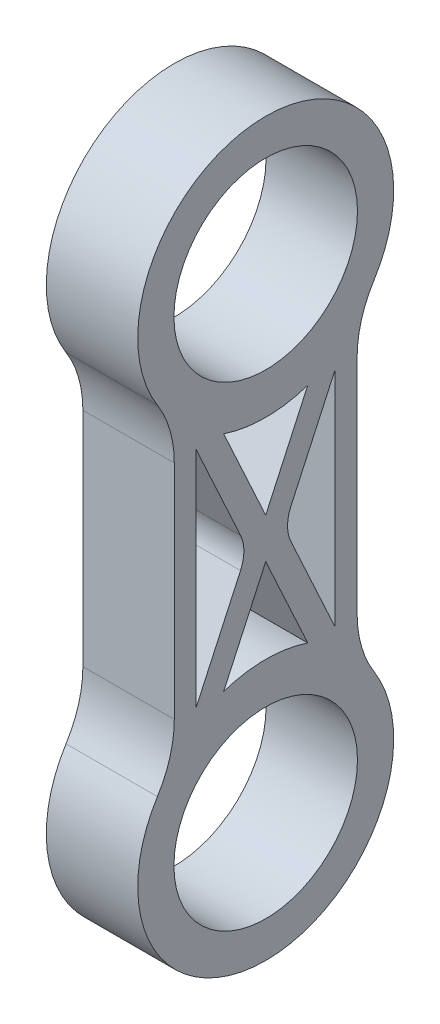
ISO-10303-21;
HEADER;
FILE_DESCRIPTION(('STEP AP214'),'2;1');
FILE_NAME('part.step','',(''),(''),'','','');
FILE_SCHEMA(('AUTOMOTIVE_DESIGN { 1 0 10303 214 1 1 1 1 }'));
ENDSEC;
DATA;
#1=APPLICATION_CONTEXT('core data for automotive mechanical design processes');
#2=APPLICATION_PROTOCOL_DEFINITION('international standard','automotive_design',2000,#1);
#3=PRODUCT_CONTEXT('',#1,'mechanical');
#4=PRODUCT('Part','Part','',(#3));
#5=PRODUCT_RELATED_PRODUCT_CATEGORY('part','',(#4));
#6=PRODUCT_DEFINITION_FORMATION('','',#4);
#7=PRODUCT_DEFINITION_CONTEXT('part definition',#1,'design');
#8=PRODUCT_DEFINITION('design','',#6,#7);
#9=PRODUCT_DEFINITION_SHAPE('','',#8);
#10=(LENGTH_UNIT() NAMED_UNIT(*) SI_UNIT(.MILLI.,.METRE.));
#11=(NAMED_UNIT(*) PLANE_ANGLE_UNIT() SI_UNIT($,.RADIAN.));
#12=(NAMED_UNIT(*) SI_UNIT($,.STERADIAN.) SOLID_ANGLE_UNIT());
#13=UNCERTAINTY_MEASURE_WITH_UNIT(LENGTH_MEASURE(1.E-05),#10,'distance_accuracy_value','');
#14=(GEOMETRIC_REPRESENTATION_CONTEXT(3) GLOBAL_UNCERTAINTY_ASSIGNED_CONTEXT((#13)) GLOBAL_UNIT_ASSIGNED_CONTEXT((#10,
#11,#12)) REPRESENTATION_CONTEXT('',''));
#15=CARTESIAN_POINT('',(0.,0.,0.));
#16=DIRECTION('',(0.,0.,1.));
#17=DIRECTION('',(1.,0.,0.));
#18=AXIS2_PLACEMENT_3D('',#15,#16,#17);
#19=CARTESIAN_POINT('',(2.5,38.670285511681,35.9952211988792));
#20=DIRECTION('',(0.,0.,-1.));
#21=DIRECTION('',(-1.,0.,0.));
#22=AXIS2_PLACEMENT_3D('',#19,#20,#21);
#23=PLANE('',#22);
#24=DIRECTION('',(0.,-1.,0.));
#25=VECTOR('',#24,1.);
#26=CARTESIAN_POINT('',(2.5,38.670285511681,35.9952211988792));
#27=LINE('',#26,#25);
#28=CARTESIAN_POINT('',(2.5,35.2061838965432,35.9952211988792));
#29=VERTEX_POINT('',#28);
#30=CARTESIAN_POINT('',(2.5,29.1343871268187,35.9952211988792));
#31=VERTEX_POINT('',#30);
#32=EDGE_CURVE('E309',#29,#31,#27,.T.);
#33=ORIENTED_EDGE('',*,*,#32,.F.);
#34=DIRECTION('',(1.,0.,0.));
#35=VECTOR('',#34,1.);
#36=CARTESIAN_POINT('',(2.5,35.2061838965432,35.9952211988792));
#37=LINE('',#36,#35);
#38=CARTESIAN_POINT('',(0.,35.2061838965432,35.9952211988792));
#39=VERTEX_POINT('',#38);
#40=EDGE_CURVE('E323',#29,#39,#37,.F.);
#41=ORIENTED_EDGE('',*,*,#40,.T.);
#42=DIRECTION('',(0.,-1.,0.));
#43=VECTOR('',#42,1.);
#44=CARTESIAN_POINT('',(0.,38.670285511681,35.9952211988792));
#45=LINE('',#44,#43);
#46=CARTESIAN_POINT('',(0.,29.1343871268187,35.9952211988792));
#47=VERTEX_POINT('',#46);
#48=EDGE_CURVE('E306',#39,#47,#45,.T.);
#49=ORIENTED_EDGE('',*,*,#48,.T.);
#50=DIRECTION('',(1.,0.,0.));
#51=VECTOR('',#50,1.);
#52=CARTESIAN_POINT('',(2.5,29.1343871268187,35.9952211988792));
#53=LINE('',#52,#51);
#54=EDGE_CURVE('E316',#47,#31,#53,.T.);
#55=ORIENTED_EDGE('',*,*,#54,.T.);
#56=EDGE_LOOP('',(#33,#41,#49,#55));
#57=FACE_BOUND('',#56,.T.);
#58=ADVANCED_FACE('F37',(#57),#23,.F.);
#59=CARTESIAN_POINT('',(2.5,38.670285511681,30.9952211988792));
#60=DIRECTION('',(0.,0.,1.));
#61=DIRECTION('',(0.,-1.,0.));
#62=AXIS2_PLACEMENT_3D('',#59,#60,#61);
#63=PLANE('',#62);
#64=DIRECTION('',(0.,1.,0.));
#65=VECTOR('',#64,1.);
#66=CARTESIAN_POINT('',(0.,38.670285511681,30.9952211988792));
#67=LINE('',#66,#65);
#68=CARTESIAN_POINT('',(0.,29.1343871268187,30.9952211988791));
#69=VERTEX_POINT('',#68);
#70=CARTESIAN_POINT('',(0.,35.2061838965432,30.9952211988792));
#71=VERTEX_POINT('',#70);
#72=EDGE_CURVE('E313',#69,#71,#67,.T.);
#73=ORIENTED_EDGE('',*,*,#72,.T.);
#74=DIRECTION('',(1.,0.,0.));
#75=VECTOR('',#74,1.);
#76=CARTESIAN_POINT('',(2.5,35.2061838965432,30.9952211988792));
#77=LINE('',#76,#75);
#78=CARTESIAN_POINT('',(2.5,35.2061838965432,30.9952211988792));
#79=VERTEX_POINT('',#78);
#80=EDGE_CURVE('E333',#71,#79,#77,.T.);
#81=ORIENTED_EDGE('',*,*,#80,.T.);
#82=DIRECTION('',(0.,1.,0.));
#83=VECTOR('',#82,1.);
#84=CARTESIAN_POINT('',(2.5,38.670285511681,30.9952211988792));
#85=LINE('',#84,#83);
#86=CARTESIAN_POINT('',(2.5,29.1343871268187,30.9952211988791));
#87=VERTEX_POINT('',#86);
#88=EDGE_CURVE('E312',#87,#79,#85,.T.);
#89=ORIENTED_EDGE('',*,*,#88,.F.);
#90=DIRECTION('',(1.,0.,0.));
#91=VECTOR('',#90,1.);
#92=CARTESIAN_POINT('',(2.5,29.1343871268187,30.9952211988791));
#93=LINE('',#92,#91);
#94=EDGE_CURVE('E330',#87,#69,#93,.F.);
#95=ORIENTED_EDGE('',*,*,#94,.T.);
#96=EDGE_LOOP('',(#73,#81,#89,#95));
#97=FACE_BOUND('',#96,.T.);
#98=ADVANCED_FACE('F401',(#97),#63,.F.);
#99=CARTESIAN_POINT('',(2.5,38.670285511681,33.4952211988792));
#100=DIRECTION('',(-1.,0.,0.));
#101=DIRECTION('',(0.,0.,1.));
#102=AXIS2_PLACEMENT_3D('',#99,#100,#101);
#103=PLANE('',#102);
#104=DIRECTION('',(0.,-0.908490452678574,-0.417905608232146));
#105=VECTOR('',#104,1.);
#106=CARTESIAN_POINT('',(2.5,35.2207957688978,34.6452211988792));
#107=LINE('',#106,#105);
#108=CARTESIAN_POINT('',(2.5,35.2207957688978,34.6452211988792));
#109=VERTEX_POINT('',#108);
#110=CARTESIAN_POINT('',(2.5,32.7207957688978,33.4952211988792));
#111=VERTEX_POINT('',#110);
#112=EDGE_CURVE('E233',#109,#111,#107,.T.);
#113=ORIENTED_EDGE('',*,*,#112,.F.);
#114=CARTESIAN_POINT('',(2.5,38.670285511681,33.4952211988792));
#115=DIRECTION('',(-1.,0.,0.));
#116=DIRECTION('',(0.,0.,-1.));
#117=AXIS2_PLACEMENT_3D('',#114,#115,#116);
#118=CIRCLE('',#117,3.63613524027454);
#119=CARTESIAN_POINT('',(2.5,35.2207957688978,32.3452211988791));
#120=VERTEX_POINT('',#119);
#121=EDGE_CURVE('E219',#120,#109,#118,.T.);
#122=ORIENTED_EDGE('',*,*,#121,.F.);
#123=DIRECTION('',(0.,0.908490452678574,-0.417905608232146));
#124=VECTOR('',#123,1.);
#125=CARTESIAN_POINT('',(2.5,32.7207957688978,33.4952211988792));
#126=LINE('',#125,#124);
#127=EDGE_CURVE('E225',#111,#120,#126,.T.);
#128=ORIENTED_EDGE('',*,*,#127,.F.);
#129=EDGE_LOOP('',(#113,#122,#128));
#130=FACE_BOUND('',#129,.T.);
#131=DIRECTION('',(0.,-0.908490452678575,-0.417905608232144));
#132=VECTOR('',#131,1.);
#133=CARTESIAN_POINT('',(2.5,29.1197752544641,31.5952211988791));
#134=LINE('',#133,#132);
#135=CARTESIAN_POINT('',(2.5,31.7523799034488,32.8062193374121));
#136=VERTEX_POINT('',#135);
#137=CARTESIAN_POINT('',(2.5,29.1197752544641,31.5952211988791));
#138=VERTEX_POINT('',#137);
#139=EDGE_CURVE('E255',#136,#138,#134,.T.);
#140=ORIENTED_EDGE('',*,*,#139,.F.);
#141=CARTESIAN_POINT('',(2.5,32.170285511681,31.8977288847335));
#142=DIRECTION('',(-1.,0.,0.));
#143=DIRECTION('',(0.,0.,1.));
#144=AXIS2_PLACEMENT_3D('',#141,#142,#143);
#145=CIRCLE('',#144,1.);
#146=CARTESIAN_POINT('',(2.5,32.5881911199131,32.8062193374121));
#147=VERTEX_POINT('',#146);
#148=EDGE_CURVE('E45',#136,#147,#145,.T.);
#149=ORIENTED_EDGE('',*,*,#148,.T.);
#150=DIRECTION('',(0.,-0.908490452678574,0.417905608232145));
#151=VECTOR('',#150,1.);
#152=CARTESIAN_POINT('',(2.5,32.170285511681,32.9984559171989));
#153=LINE('',#152,#151);
#154=CARTESIAN_POINT('',(2.5,35.2207957688978,31.5952211988791));
#155=VERTEX_POINT('',#154);
#156=EDGE_CURVE('E240',#155,#147,#153,.T.);
#157=ORIENTED_EDGE('',*,*,#156,.F.);
#158=DIRECTION('',(0.,1.,0.));
#159=VECTOR('',#158,1.);
#160=CARTESIAN_POINT('',(2.5,35.2207957688978,31.5952211988791));
#161=LINE('',#160,#159);
#162=EDGE_CURVE('E248',#138,#155,#161,.T.);
#163=ORIENTED_EDGE('',*,*,#162,.F.);
#164=EDGE_LOOP('',(#140,#149,#157,#163));
#165=FACE_BOUND('',#164,.T.);
#166=CARTESIAN_POINT('',(2.5,25.670285511681,33.4952211988792));
#167=DIRECTION('',(-1.,0.,0.));
#168=DIRECTION('',(0.,0.,1.));
#169=AXIS2_PLACEMENT_3D('',#166,#167,#168);
#170=CIRCLE('',#169,3.63613524027453);
#171=CARTESIAN_POINT('',(2.5,29.1197752544641,34.6452211988792));
#172=VERTEX_POINT('',#171);
#173=CARTESIAN_POINT('',(2.5,29.1197752544641,32.3452211988791));
#174=VERTEX_POINT('',#173);
#175=EDGE_CURVE('E211',#172,#174,#170,.T.);
#176=ORIENTED_EDGE('',*,*,#175,.F.);
#177=DIRECTION('',(0.,-0.908490452678574,0.417905608232146));
#178=VECTOR('',#177,1.);
#179=CARTESIAN_POINT('',(2.5,31.6197752544641,33.4952211988792));
#180=LINE('',#179,#178);
#181=CARTESIAN_POINT('',(2.5,31.6197752544641,33.4952211988792));
#182=VERTEX_POINT('',#181);
#183=EDGE_CURVE('E193',#182,#172,#180,.T.);
#184=ORIENTED_EDGE('',*,*,#183,.F.);
#185=DIRECTION('',(0.,0.908490452678574,0.417905608232146));
#186=VECTOR('',#185,1.);
#187=CARTESIAN_POINT('',(2.5,31.6197752544641,33.4952211988792));
#188=LINE('',#187,#186);
#189=EDGE_CURVE('E208',#174,#182,#188,.T.);
#190=ORIENTED_EDGE('',*,*,#189,.F.);
#191=EDGE_LOOP('',(#176,#184,#190));
#192=FACE_BOUND('',#191,.T.);
#193=DIRECTION('',(0.,-1.,0.));
#194=VECTOR('',#193,1.);
#195=CARTESIAN_POINT('',(2.5,35.2207957688978,35.3952211988791));
#196=LINE('',#195,#194);
#197=CARTESIAN_POINT('',(2.5,35.2207957688978,35.3952211988791));
#198=VERTEX_POINT('',#197);
#199=CARTESIAN_POINT('',(2.5,29.1197752544641,35.3952211988791));
#200=VERTEX_POINT('',#199);
#201=EDGE_CURVE('E275',#198,#200,#196,.T.);
#202=ORIENTED_EDGE('',*,*,#201,.F.);
#203=DIRECTION('',(0.,0.908490452678575,0.417905608232145));
#204=VECTOR('',#203,1.);
#205=CARTESIAN_POINT('',(2.5,32.170285511681,33.9919864805594));
#206=LINE('',#205,#204);
#207=CARTESIAN_POINT('',(2.5,32.5881911199131,34.1842230603462));
#208=VERTEX_POINT('',#207);
#209=EDGE_CURVE('E261',#208,#198,#206,.T.);
#210=ORIENTED_EDGE('',*,*,#209,.F.);
#211=CARTESIAN_POINT('',(2.5,32.170285511681,35.0927135130248));
#212=DIRECTION('',(-1.,0.,0.));
#213=DIRECTION('',(0.,0.,1.));
#214=AXIS2_PLACEMENT_3D('',#211,#212,#213);
#215=CIRCLE('',#214,1.);
#216=CARTESIAN_POINT('',(2.5,31.7523799034488,34.1842230603462));
#217=VERTEX_POINT('',#216);
#218=EDGE_CURVE('E365',#208,#217,#215,.T.);
#219=ORIENTED_EDGE('',*,*,#218,.T.);
#220=DIRECTION('',(0.,0.908490452678574,-0.417905608232145));
#221=VECTOR('',#220,1.);
#222=CARTESIAN_POINT('',(2.5,29.1197752544641,35.3952211988791));
#223=LINE('',#222,#221);
#224=EDGE_CURVE('E267',#200,#217,#223,.T.);
#225=ORIENTED_EDGE('',*,*,#224,.F.);
#226=EDGE_LOOP('',(#202,#210,#219,#225));
#227=FACE_BOUND('',#226,.T.);
#228=CARTESIAN_POINT('',(2.5,38.670285511681,33.4952211988792));
#229=DIRECTION('',(1.,0.,0.));
#230=DIRECTION('',(0.,0.,-1.));
#231=AXIS2_PLACEMENT_3D('',#228,#229,#230);
#232=CIRCLE('',#231,2.51);
#233=CARTESIAN_POINT('',(2.5,38.670285511681,30.9852211988791));
#234=VERTEX_POINT('',#233);
#235=EDGE_CURVE('E289',#234,#234,#232,.T.);
#236=ORIENTED_EDGE('',*,*,#235,.F.);
#237=EDGE_LOOP('',(#236));
#238=FACE_BOUND('',#237,.T.);
#239=CARTESIAN_POINT('',(2.5,25.670285511681,33.4952211988792));
#240=DIRECTION('',(1.,0.,0.));
#241=DIRECTION('',(0.,0.,-1.));
#242=AXIS2_PLACEMENT_3D('',#239,#240,#241);
#243=CIRCLE('',#242,2.51);
#244=CARTESIAN_POINT('',(2.5,25.670285511681,30.9852211988791));
#245=VERTEX_POINT('',#244);
#246=EDGE_CURVE('E282',#245,#245,#243,.T.);
#247=ORIENTED_EDGE('',*,*,#246,.F.);
#248=EDGE_LOOP('',(#247));
#249=FACE_BOUND('',#248,.T.);
#250=CARTESIAN_POINT('',(2.5,38.670285511681,33.4952211988792));
#251=DIRECTION('',(1.,0.,0.));
#252=DIRECTION('',(0.,0.,-1.));
#253=AXIS2_PLACEMENT_3D('',#250,#251,#252);
#254=CIRCLE('',#253,3.5);
#255=CARTESIAN_POINT('',(2.5,36.8050000266068,30.5336827373407));
#256=VERTEX_POINT('',#255);
#257=CARTESIAN_POINT('',(2.5,36.8050000266068,36.4567596604176));
#258=VERTEX_POINT('',#257);
#259=EDGE_CURVE('E300',#256,#258,#254,.T.);
#260=ORIENTED_EDGE('',*,*,#259,.T.);
#261=CARTESIAN_POINT('',(2.5,35.2061838965432,38.9952211988792));
#262=DIRECTION('',(-1.,0.,0.));
#263=DIRECTION('',(0.,0.,1.));
#264=AXIS2_PLACEMENT_3D('',#261,#262,#263);
#265=CIRCLE('',#264,3.);
#266=EDGE_CURVE('E342',#258,#29,#265,.T.);
#267=ORIENTED_EDGE('',*,*,#266,.T.);
#268=ORIENTED_EDGE('',*,*,#32,.T.);
#269=CARTESIAN_POINT('',(2.5,29.1343871268187,38.9952211988792));
#270=DIRECTION('',(-1.,0.,0.));
#271=DIRECTION('',(0.,0.,1.));
#272=AXIS2_PLACEMENT_3D('',#269,#270,#271);
#273=CIRCLE('',#272,3.);
#274=CARTESIAN_POINT('',(2.5,27.5355709967551,36.4567596604176));
#275=VERTEX_POINT('',#274);
#276=EDGE_CURVE('E352',#31,#275,#273,.T.);
#277=ORIENTED_EDGE('',*,*,#276,.T.);
#278=CARTESIAN_POINT('',(2.5,25.670285511681,33.4952211988792));
#279=DIRECTION('',(1.,0.,0.));
#280=DIRECTION('',(0.,0.,-1.));
#281=AXIS2_PLACEMENT_3D('',#278,#279,#280);
#282=CIRCLE('',#281,3.5);
#283=CARTESIAN_POINT('',(2.5,27.5355709967551,30.5336827373407));
#284=VERTEX_POINT('',#283);
#285=EDGE_CURVE('E288',#275,#284,#282,.T.);
#286=ORIENTED_EDGE('',*,*,#285,.T.);
#287=CARTESIAN_POINT('',(2.5,29.1343871268187,27.9952211988791));
#288=DIRECTION('',(-1.,0.,0.));
#289=DIRECTION('',(0.,0.,1.));
#290=AXIS2_PLACEMENT_3D('',#287,#288,#289);
#291=CIRCLE('',#290,3.);
#292=EDGE_CURVE('E350',#284,#87,#291,.T.);
#293=ORIENTED_EDGE('',*,*,#292,.T.);
#294=ORIENTED_EDGE('',*,*,#88,.T.);
#295=CARTESIAN_POINT('',(2.5,35.2061838965432,27.9952211988792));
#296=DIRECTION('',(-1.,0.,0.));
#297=DIRECTION('',(0.,0.,1.));
#298=AXIS2_PLACEMENT_3D('',#295,#296,#297);
#299=CIRCLE('',#298,3.);
#300=EDGE_CURVE('E344',#79,#256,#299,.T.);
#301=ORIENTED_EDGE('',*,*,#300,.T.);
#302=EDGE_LOOP('',(#260,#267,#268,#277,#286,#293,#294,#301));
#303=FACE_BOUND('',#302,.T.);
#304=ADVANCED_FACE('F383',(#130,#165,#192,#227,#238,#249,#303),#103,.F.);
#305=CARTESIAN_POINT('',(0.,38.670285511681,33.4952211988792));
#306=DIRECTION('',(-1.,0.,0.));
#307=DIRECTION('',(0.,0.,1.));
#308=AXIS2_PLACEMENT_3D('',#305,#306,#307);
#309=PLANE('',#308);
#310=CARTESIAN_POINT('',(0.,38.670285511681,33.4952211988792));
#311=DIRECTION('',(-1.,0.,0.));
#312=DIRECTION('',(0.,0.,-1.));
#313=AXIS2_PLACEMENT_3D('',#310,#311,#312);
#314=CIRCLE('',#313,3.63613524027454);
#315=CARTESIAN_POINT('',(0.,35.2207957688978,32.3452211988791));
#316=VERTEX_POINT('',#315);
#317=CARTESIAN_POINT('',(0.,35.2207957688978,34.6452211988792));
#318=VERTEX_POINT('',#317);
#319=EDGE_CURVE('E221',#316,#318,#314,.T.);
#320=ORIENTED_EDGE('',*,*,#319,.T.);
#321=DIRECTION('',(0.,-0.908490452678574,-0.417905608232146));
#322=VECTOR('',#321,1.);
#323=CARTESIAN_POINT('',(0.,35.2207957688978,34.6452211988792));
#324=LINE('',#323,#322);
#325=CARTESIAN_POINT('',(0.,32.7207957688978,33.4952211988792));
#326=VERTEX_POINT('',#325);
#327=EDGE_CURVE('E224',#318,#326,#324,.T.);
#328=ORIENTED_EDGE('',*,*,#327,.T.);
#329=DIRECTION('',(0.,0.908490452678574,-0.417905608232146));
#330=VECTOR('',#329,1.);
#331=CARTESIAN_POINT('',(0.,32.7207957688978,33.4952211988792));
#332=LINE('',#331,#330);
#333=EDGE_CURVE('E228',#326,#316,#332,.T.);
#334=ORIENTED_EDGE('',*,*,#333,.T.);
#335=EDGE_LOOP('',(#320,#328,#334));
#336=FACE_BOUND('',#335,.T.);
#337=DIRECTION('',(0.,-0.908490452678574,0.417905608232145));
#338=VECTOR('',#337,1.);
#339=CARTESIAN_POINT('',(0.,32.170285511681,32.9984559171989));
#340=LINE('',#339,#338);
#341=CARTESIAN_POINT('',(0.,35.2207957688978,31.5952211988791));
#342=VERTEX_POINT('',#341);
#343=CARTESIAN_POINT('',(0.,32.5881911199131,32.8062193374121));
#344=VERTEX_POINT('',#343);
#345=EDGE_CURVE('E245',#342,#344,#340,.T.);
#346=ORIENTED_EDGE('',*,*,#345,.T.);
#347=CARTESIAN_POINT('',(0.,32.170285511681,31.8977288847335));
#348=DIRECTION('',(-1.,0.,0.));
#349=DIRECTION('',(0.,0.,1.));
#350=AXIS2_PLACEMENT_3D('',#347,#348,#349);
#351=CIRCLE('',#350,1.);
#352=CARTESIAN_POINT('',(0.,31.7523799034488,32.8062193374121));
#353=VERTEX_POINT('',#352);
#354=EDGE_CURVE('E11',#344,#353,#351,.F.);
#355=ORIENTED_EDGE('',*,*,#354,.T.);
#356=DIRECTION('',(0.,-0.908490452678575,-0.417905608232144));
#357=VECTOR('',#356,1.);
#358=CARTESIAN_POINT('',(0.,29.1197752544641,31.5952211988791));
#359=LINE('',#358,#357);
#360=CARTESIAN_POINT('',(0.,29.1197752544641,31.5952211988791));
#361=VERTEX_POINT('',#360);
#362=EDGE_CURVE('E247',#353,#361,#359,.T.);
#363=ORIENTED_EDGE('',*,*,#362,.T.);
#364=DIRECTION('',(0.,1.,0.));
#365=VECTOR('',#364,1.);
#366=CARTESIAN_POINT('',(0.,35.2207957688978,31.5952211988791));
#367=LINE('',#366,#365);
#368=EDGE_CURVE('E250',#361,#342,#367,.T.);
#369=ORIENTED_EDGE('',*,*,#368,.T.);
#370=EDGE_LOOP('',(#346,#355,#363,#369));
#371=FACE_BOUND('',#370,.T.);
#372=DIRECTION('',(0.,-0.908490452678574,0.417905608232146));
#373=VECTOR('',#372,1.);
#374=CARTESIAN_POINT('',(0.,31.6197752544641,33.4952211988792));
#375=LINE('',#374,#373);
#376=CARTESIAN_POINT('',(0.,31.6197752544641,33.4952211988792));
#377=VERTEX_POINT('',#376);
#378=CARTESIAN_POINT('',(0.,29.1197752544641,34.6452211988792));
#379=VERTEX_POINT('',#378);
#380=EDGE_CURVE('E190',#377,#379,#375,.T.);
#381=ORIENTED_EDGE('',*,*,#380,.T.);
#382=CARTESIAN_POINT('',(0.,25.670285511681,33.4952211988792));
#383=DIRECTION('',(-1.,0.,0.));
#384=DIRECTION('',(0.,0.,1.));
#385=AXIS2_PLACEMENT_3D('',#382,#383,#384);
#386=CIRCLE('',#385,3.63613524027453);
#387=CARTESIAN_POINT('',(0.,29.1197752544641,32.3452211988791));
#388=VERTEX_POINT('',#387);
#389=EDGE_CURVE('E202',#379,#388,#386,.T.);
#390=ORIENTED_EDGE('',*,*,#389,.T.);
#391=DIRECTION('',(0.,0.908490452678574,0.417905608232146));
#392=VECTOR('',#391,1.);
#393=CARTESIAN_POINT('',(0.,31.6197752544641,33.4952211988792));
#394=LINE('',#393,#392);
#395=EDGE_CURVE('E198',#388,#377,#394,.T.);
#396=ORIENTED_EDGE('',*,*,#395,.T.);
#397=EDGE_LOOP('',(#381,#390,#396));
#398=FACE_BOUND('',#397,.T.);
#399=DIRECTION('',(0.,0.908490452678574,-0.417905608232145));
#400=VECTOR('',#399,1.);
#401=CARTESIAN_POINT('',(0.,29.1197752544641,35.3952211988791));
#402=LINE('',#401,#400);
#403=CARTESIAN_POINT('',(0.,29.1197752544641,35.3952211988791));
#404=VERTEX_POINT('',#403);
#405=CARTESIAN_POINT('',(0.,31.7523799034488,34.1842230603462));
#406=VERTEX_POINT('',#405);
#407=EDGE_CURVE('E270',#404,#406,#402,.T.);
#408=ORIENTED_EDGE('',*,*,#407,.T.);
#409=CARTESIAN_POINT('',(0.,32.170285511681,35.0927135130248));
#410=DIRECTION('',(-1.,0.,0.));
#411=DIRECTION('',(0.,0.,1.));
#412=AXIS2_PLACEMENT_3D('',#409,#410,#411);
#413=CIRCLE('',#412,1.);
#414=CARTESIAN_POINT('',(0.,32.5881911199131,34.1842230603462));
#415=VERTEX_POINT('',#414);
#416=EDGE_CURVE('E367',#406,#415,#413,.F.);
#417=ORIENTED_EDGE('',*,*,#416,.T.);
#418=DIRECTION('',(0.,0.908490452678575,0.417905608232145));
#419=VECTOR('',#418,1.);
#420=CARTESIAN_POINT('',(0.,32.170285511681,33.9919864805594));
#421=LINE('',#420,#419);
#422=CARTESIAN_POINT('',(0.,35.2207957688978,35.3952211988791));
#423=VERTEX_POINT('',#422);
#424=EDGE_CURVE('E264',#415,#423,#421,.T.);
#425=ORIENTED_EDGE('',*,*,#424,.T.);
#426=DIRECTION('',(0.,-1.,0.));
#427=VECTOR('',#426,1.);
#428=CARTESIAN_POINT('',(0.,35.2207957688978,35.3952211988791));
#429=LINE('',#428,#427);
#430=EDGE_CURVE('E266',#423,#404,#429,.T.);
#431=ORIENTED_EDGE('',*,*,#430,.T.);
#432=EDGE_LOOP('',(#408,#417,#425,#431));
#433=FACE_BOUND('',#432,.T.);
#434=CARTESIAN_POINT('',(0.,38.670285511681,33.4952211988792));
#435=DIRECTION('',(1.,0.,0.));
#436=DIRECTION('',(0.,0.,-1.));
#437=AXIS2_PLACEMENT_3D('',#434,#435,#436);
#438=CIRCLE('',#437,2.51);
#439=CARTESIAN_POINT('',(0.,38.670285511681,30.9852211988791));
#440=VERTEX_POINT('',#439);
#441=EDGE_CURVE('E285',#440,#440,#438,.T.);
#442=ORIENTED_EDGE('',*,*,#441,.T.);
#443=EDGE_LOOP('',(#442));
#444=FACE_BOUND('',#443,.T.);
#445=CARTESIAN_POINT('',(0.,25.670285511681,33.4952211988792));
#446=DIRECTION('',(1.,0.,0.));
#447=DIRECTION('',(0.,0.,-1.));
#448=AXIS2_PLACEMENT_3D('',#445,#446,#447);
#449=CIRCLE('',#448,2.51);
#450=CARTESIAN_POINT('',(0.,25.670285511681,30.9852211988791));
#451=VERTEX_POINT('',#450);
#452=EDGE_CURVE('E292',#451,#451,#449,.T.);
#453=ORIENTED_EDGE('',*,*,#452,.T.);
#454=EDGE_LOOP('',(#453));
#455=FACE_BOUND('',#454,.T.);
#456=ORIENTED_EDGE('',*,*,#72,.F.);
#457=CARTESIAN_POINT('',(0.,29.1343871268187,27.9952211988791));
#458=DIRECTION('',(-1.,0.,0.));
#459=DIRECTION('',(0.,0.,1.));
#460=AXIS2_PLACEMENT_3D('',#457,#458,#459);
#461=CIRCLE('',#460,3.);
#462=CARTESIAN_POINT('',(0.,27.5355709967551,30.5336827373407));
#463=VERTEX_POINT('',#462);
#464=EDGE_CURVE('E348',#69,#463,#461,.F.);
#465=ORIENTED_EDGE('',*,*,#464,.T.);
#466=CARTESIAN_POINT('',(0.,25.670285511681,33.4952211988792));
#467=DIRECTION('',(1.,0.,0.));
#468=DIRECTION('',(0.,0.,-1.));
#469=AXIS2_PLACEMENT_3D('',#466,#467,#468);
#470=CIRCLE('',#469,3.5);
#471=CARTESIAN_POINT('',(0.,27.5355709967551,36.4567596604176));
#472=VERTEX_POINT('',#471);
#473=EDGE_CURVE('E297',#472,#463,#470,.T.);
#474=ORIENTED_EDGE('',*,*,#473,.F.);
#475=CARTESIAN_POINT('',(0.,29.1343871268187,38.9952211988792));
#476=DIRECTION('',(-1.,0.,0.));
#477=DIRECTION('',(0.,0.,1.));
#478=AXIS2_PLACEMENT_3D('',#475,#476,#477);
#479=CIRCLE('',#478,3.);
#480=EDGE_CURVE('E354',#472,#47,#479,.F.);
#481=ORIENTED_EDGE('',*,*,#480,.T.);
#482=ORIENTED_EDGE('',*,*,#48,.F.);
#483=CARTESIAN_POINT('',(0.,35.2061838965432,38.9952211988792));
#484=DIRECTION('',(-1.,0.,0.));
#485=DIRECTION('',(0.,0.,1.));
#486=AXIS2_PLACEMENT_3D('',#483,#484,#485);
#487=CIRCLE('',#486,3.);
#488=CARTESIAN_POINT('',(0.,36.8050000266068,36.4567596604176));
#489=VERTEX_POINT('',#488);
#490=EDGE_CURVE('E340',#39,#489,#487,.F.);
#491=ORIENTED_EDGE('',*,*,#490,.T.);
#492=CARTESIAN_POINT('',(0.,38.670285511681,33.4952211988792));
#493=DIRECTION('',(1.,0.,0.));
#494=DIRECTION('',(0.,0.,-1.));
#495=AXIS2_PLACEMENT_3D('',#492,#493,#494);
#496=CIRCLE('',#495,3.5);
#497=CARTESIAN_POINT('',(0.,36.8050000266068,30.5336827373407));
#498=VERTEX_POINT('',#497);
#499=EDGE_CURVE('E303',#498,#489,#496,.T.);
#500=ORIENTED_EDGE('',*,*,#499,.F.);
#501=CARTESIAN_POINT('',(0.,35.2061838965432,27.9952211988792));
#502=DIRECTION('',(-1.,0.,0.));
#503=DIRECTION('',(0.,0.,1.));
#504=AXIS2_PLACEMENT_3D('',#501,#502,#503);
#505=CIRCLE('',#504,3.);
#506=EDGE_CURVE('E346',#498,#71,#505,.F.);
#507=ORIENTED_EDGE('',*,*,#506,.T.);
#508=EDGE_LOOP('',(#456,#465,#474,#481,#482,#491,#500,#507));
#509=FACE_BOUND('',#508,.T.);
#510=ADVANCED_FACE('F206',(#336,#371,#398,#433,#444,#455,#509),#309,.T.);
#511=CARTESIAN_POINT('',(0.,38.670285511681,33.4952211988792));
#512=DIRECTION('',(1.,0.,0.));
#513=DIRECTION('',(0.,0.,-1.));
#514=AXIS2_PLACEMENT_3D('',#511,#512,#513);
#515=CYLINDRICAL_SURFACE('',#514,3.5);
#516=ORIENTED_EDGE('',*,*,#499,.T.);
#517=DIRECTION('',(1.,0.,0.));
#518=VECTOR('',#517,1.);
#519=CARTESIAN_POINT('',(0.,36.8050000266068,36.4567596604176));
#520=LINE('',#519,#518);
#521=EDGE_CURVE('E328',#489,#258,#520,.T.);
#522=ORIENTED_EDGE('',*,*,#521,.T.);
#523=ORIENTED_EDGE('',*,*,#259,.F.);
#524=DIRECTION('',(1.,0.,0.));
#525=VECTOR('',#524,1.);
#526=CARTESIAN_POINT('',(0.,36.8050000266068,30.5336827373407));
#527=LINE('',#526,#525);
#528=EDGE_CURVE('E326',#256,#498,#527,.F.);
#529=ORIENTED_EDGE('',*,*,#528,.T.);
#530=EDGE_LOOP('',(#516,#522,#523,#529));
#531=FACE_BOUND('',#530,.T.);
#532=ADVANCED_FACE('F481',(#531),#515,.T.);
#533=CARTESIAN_POINT('',(0.,25.670285511681,33.4952211988792));
#534=DIRECTION('',(1.,0.,0.));
#535=DIRECTION('',(0.,0.,-1.));
#536=AXIS2_PLACEMENT_3D('',#533,#534,#535);
#537=CYLINDRICAL_SURFACE('',#536,3.5);
#538=ORIENTED_EDGE('',*,*,#473,.T.);
#539=DIRECTION('',(1.,0.,0.));
#540=VECTOR('',#539,1.);
#541=CARTESIAN_POINT('',(0.,27.5355709967551,30.5336827373407));
#542=LINE('',#541,#540);
#543=EDGE_CURVE('E338',#463,#284,#542,.T.);
#544=ORIENTED_EDGE('',*,*,#543,.T.);
#545=ORIENTED_EDGE('',*,*,#285,.F.);
#546=DIRECTION('',(1.,0.,0.));
#547=VECTOR('',#546,1.);
#548=CARTESIAN_POINT('',(0.,27.5355709967551,36.4567596604176));
#549=LINE('',#548,#547);
#550=EDGE_CURVE('E336',#275,#472,#549,.F.);
#551=ORIENTED_EDGE('',*,*,#550,.T.);
#552=EDGE_LOOP('',(#538,#544,#545,#551));
#553=FACE_BOUND('',#552,.T.);
#554=ADVANCED_FACE('F487',(#553),#537,.T.);
#555=CARTESIAN_POINT('',(0.,25.670285511681,33.4952211988792));
#556=DIRECTION('',(1.,0.,0.));
#557=DIRECTION('',(0.,0.,-1.));
#558=AXIS2_PLACEMENT_3D('',#555,#556,#557);
#559=CYLINDRICAL_SURFACE('',#558,2.51);
#560=ORIENTED_EDGE('',*,*,#452,.F.);
#561=EDGE_LOOP('',(#560));
#562=FACE_BOUND('',#561,.T.);
#563=ORIENTED_EDGE('',*,*,#246,.T.);
#564=EDGE_LOOP('',(#563));
#565=FACE_BOUND('',#564,.T.);
#566=ADVANCED_FACE('F491',(#562,#565),#559,.F.);
#567=CARTESIAN_POINT('',(0.,38.670285511681,33.4952211988792));
#568=DIRECTION('',(1.,0.,0.));
#569=DIRECTION('',(0.,0.,-1.));
#570=AXIS2_PLACEMENT_3D('',#567,#568,#569);
#571=CYLINDRICAL_SURFACE('',#570,2.51);
#572=ORIENTED_EDGE('',*,*,#441,.F.);
#573=EDGE_LOOP('',(#572));
#574=FACE_BOUND('',#573,.T.);
#575=ORIENTED_EDGE('',*,*,#235,.T.);
#576=EDGE_LOOP('',(#575));
#577=FACE_BOUND('',#576,.T.);
#578=ADVANCED_FACE('F495',(#574,#577),#571,.F.);
#579=CARTESIAN_POINT('',(0.,32.170285511681,33.9919864805594));
#580=DIRECTION('',(0.,0.417905608232145,-0.908490452678574));
#581=DIRECTION('',(0.,0.908490452678575,0.417905608232145));
#582=AXIS2_PLACEMENT_3D('',#579,#580,#581);
#583=PLANE('',#582);
#584=ORIENTED_EDGE('',*,*,#424,.F.);
#585=DIRECTION('',(1.,0.,0.));
#586=VECTOR('',#585,1.);
#587=CARTESIAN_POINT('',(2.5,32.5881911199131,34.1842230603462));
#588=LINE('',#587,#586);
#589=EDGE_CURVE('E356',#415,#208,#588,.T.);
#590=ORIENTED_EDGE('',*,*,#589,.T.);
#591=ORIENTED_EDGE('',*,*,#209,.T.);
#592=DIRECTION('',(1.,0.,0.));
#593=VECTOR('',#592,1.);
#594=CARTESIAN_POINT('',(0.,35.2207957688978,35.3952211988791));
#595=LINE('',#594,#593);
#596=EDGE_CURVE('E273',#423,#198,#595,.T.);
#597=ORIENTED_EDGE('',*,*,#596,.F.);
#598=EDGE_LOOP('',(#584,#590,#591,#597));
#599=FACE_BOUND('',#598,.T.);
#600=ADVANCED_FACE('F376',(#599),#583,.F.);
#601=CARTESIAN_POINT('',(0.,29.1197752544641,35.3952211988791));
#602=DIRECTION('',(0.,-0.417905608232145,-0.908490452678574));
#603=DIRECTION('',(0.,0.908490452678574,-0.417905608232145));
#604=AXIS2_PLACEMENT_3D('',#601,#602,#603);
#605=PLANE('',#604);
#606=ORIENTED_EDGE('',*,*,#224,.T.);
#607=DIRECTION('',(1.,0.,0.));
#608=VECTOR('',#607,1.);
#609=CARTESIAN_POINT('',(0.,31.7523799034488,34.1842230603462));
#610=LINE('',#609,#608);
#611=EDGE_CURVE('E359',#217,#406,#610,.F.);
#612=ORIENTED_EDGE('',*,*,#611,.T.);
#613=ORIENTED_EDGE('',*,*,#407,.F.);
#614=DIRECTION('',(1.,0.,0.));
#615=VECTOR('',#614,1.);
#616=CARTESIAN_POINT('',(0.,29.1197752544641,35.3952211988791));
#617=LINE('',#616,#615);
#618=EDGE_CURVE('E280',#404,#200,#617,.T.);
#619=ORIENTED_EDGE('',*,*,#618,.T.);
#620=EDGE_LOOP('',(#606,#612,#613,#619));
#621=FACE_BOUND('',#620,.T.);
#622=ADVANCED_FACE('F386',(#621),#605,.F.);
#623=CARTESIAN_POINT('',(0.,35.2207957688978,35.3952211988791));
#624=DIRECTION('',(0.,0.,1.));
#625=DIRECTION('',(1.,0.,0.));
#626=AXIS2_PLACEMENT_3D('',#623,#624,#625);
#627=PLANE('',#626);
#628=ORIENTED_EDGE('',*,*,#201,.T.);
#629=ORIENTED_EDGE('',*,*,#618,.F.);
#630=ORIENTED_EDGE('',*,*,#430,.F.);
#631=ORIENTED_EDGE('',*,*,#596,.T.);
#632=EDGE_LOOP('',(#628,#629,#630,#631));
#633=FACE_BOUND('',#632,.T.);
#634=ADVANCED_FACE('F389',(#633),#627,.F.);
#635=CARTESIAN_POINT('',(0.,31.6197752544641,33.4952211988792));
#636=DIRECTION('',(0.,0.417905608232146,0.908490452678574));
#637=DIRECTION('',(0.,-0.908490452678574,0.417905608232146));
#638=AXIS2_PLACEMENT_3D('',#635,#636,#637);
#639=PLANE('',#638);
#640=ORIENTED_EDGE('',*,*,#183,.T.);
#641=DIRECTION('',(1.,0.,0.));
#642=VECTOR('',#641,1.);
#643=CARTESIAN_POINT('',(0.,29.1197752544641,34.6452211988792));
#644=LINE('',#643,#642);
#645=EDGE_CURVE('E186',#379,#172,#644,.T.);
#646=ORIENTED_EDGE('',*,*,#645,.F.);
#647=ORIENTED_EDGE('',*,*,#380,.F.);
#648=DIRECTION('',(1.,0.,0.));
#649=VECTOR('',#648,1.);
#650=CARTESIAN_POINT('',(0.,31.6197752544641,33.4952211988792));
#651=LINE('',#650,#649);
#652=EDGE_CURVE('E217',#377,#182,#651,.T.);
#653=ORIENTED_EDGE('',*,*,#652,.T.);
#654=EDGE_LOOP('',(#640,#646,#647,#653));
#655=FACE_BOUND('',#654,.T.);
#656=ADVANCED_FACE('F188',(#655),#639,.F.);
#657=CARTESIAN_POINT('',(0.,31.6197752544641,33.4952211988792));
#658=DIRECTION('',(0.,0.417905608232146,-0.908490452678574));
#659=DIRECTION('',(0.,0.908490452678574,0.417905608232146));
#660=AXIS2_PLACEMENT_3D('',#657,#658,#659);
#661=PLANE('',#660);
#662=ORIENTED_EDGE('',*,*,#189,.T.);
#663=ORIENTED_EDGE('',*,*,#652,.F.);
#664=ORIENTED_EDGE('',*,*,#395,.F.);
#665=DIRECTION('',(1.,0.,0.));
#666=VECTOR('',#665,1.);
#667=CARTESIAN_POINT('',(0.,29.1197752544641,32.3452211988791));
#668=LINE('',#667,#666);
#669=EDGE_CURVE('E197',#388,#174,#668,.T.);
#670=ORIENTED_EDGE('',*,*,#669,.T.);
#671=EDGE_LOOP('',(#662,#663,#664,#670));
#672=FACE_BOUND('',#671,.T.);
#673=ADVANCED_FACE('F396',(#672),#661,.F.);
#674=CARTESIAN_POINT('',(0.,25.670285511681,33.4952211988792));
#675=DIRECTION('',(1.,0.,0.));
#676=DIRECTION('',(0.,0.,-1.));
#677=AXIS2_PLACEMENT_3D('',#674,#675,#676);
#678=CYLINDRICAL_SURFACE('',#677,3.63613524027453);
#679=ORIENTED_EDGE('',*,*,#175,.T.);
#680=ORIENTED_EDGE('',*,*,#669,.F.);
#681=ORIENTED_EDGE('',*,*,#389,.F.);
#682=ORIENTED_EDGE('',*,*,#645,.T.);
#683=EDGE_LOOP('',(#679,#680,#681,#682));
#684=FACE_BOUND('',#683,.T.);
#685=ADVANCED_FACE('F203',(#684),#678,.T.);
#686=CARTESIAN_POINT('',(0.,32.170285511681,32.9984559171989));
#687=DIRECTION('',(0.,0.417905608232145,0.908490452678574));
#688=DIRECTION('',(0.,-0.908490452678574,0.417905608232145));
#689=AXIS2_PLACEMENT_3D('',#686,#687,#688);
#690=PLANE('',#689);
#691=ORIENTED_EDGE('',*,*,#156,.T.);
#692=DIRECTION('',(1.,0.,0.));
#693=VECTOR('',#692,1.);
#694=CARTESIAN_POINT('',(0.,32.5881911199131,32.8062193374121));
#695=LINE('',#694,#693);
#696=EDGE_CURVE('E52',#147,#344,#695,.F.);
#697=ORIENTED_EDGE('',*,*,#696,.T.);
#698=ORIENTED_EDGE('',*,*,#345,.F.);
#699=DIRECTION('',(1.,0.,0.));
#700=VECTOR('',#699,1.);
#701=CARTESIAN_POINT('',(0.,35.2207957688978,31.5952211988791));
#702=LINE('',#701,#700);
#703=EDGE_CURVE('E259',#342,#155,#702,.T.);
#704=ORIENTED_EDGE('',*,*,#703,.T.);
#705=EDGE_LOOP('',(#691,#697,#698,#704));
#706=FACE_BOUND('',#705,.T.);
#707=ADVANCED_FACE('F447',(#706),#690,.F.);
#708=CARTESIAN_POINT('',(0.,35.2207957688978,31.5952211988791));
#709=DIRECTION('',(0.,0.,-1.));
#710=DIRECTION('',(-1.,0.,0.));
#711=AXIS2_PLACEMENT_3D('',#708,#709,#710);
#712=PLANE('',#711);
#713=ORIENTED_EDGE('',*,*,#162,.T.);
#714=ORIENTED_EDGE('',*,*,#703,.F.);
#715=ORIENTED_EDGE('',*,*,#368,.F.);
#716=DIRECTION('',(1.,0.,0.));
#717=VECTOR('',#716,1.);
#718=CARTESIAN_POINT('',(0.,29.1197752544641,31.5952211988791));
#719=LINE('',#718,#717);
#720=EDGE_CURVE('E253',#361,#138,#719,.T.);
#721=ORIENTED_EDGE('',*,*,#720,.T.);
#722=EDGE_LOOP('',(#713,#714,#715,#721));
#723=FACE_BOUND('',#722,.T.);
#724=ADVANCED_FACE('F445',(#723),#712,.F.);
#725=CARTESIAN_POINT('',(0.,29.1197752544641,31.5952211988791));
#726=DIRECTION('',(0.,-0.417905608232144,0.908490452678575));
#727=DIRECTION('',(0.,-0.908490452678575,-0.417905608232144));
#728=AXIS2_PLACEMENT_3D('',#725,#726,#727);
#729=PLANE('',#728);
#730=ORIENTED_EDGE('',*,*,#362,.F.);
#731=DIRECTION('',(1.,0.,0.));
#732=VECTOR('',#731,1.);
#733=CARTESIAN_POINT('',(2.5,31.7523799034488,32.8062193374121));
#734=LINE('',#733,#732);
#735=EDGE_CURVE('E361',#353,#136,#734,.T.);
#736=ORIENTED_EDGE('',*,*,#735,.T.);
#737=ORIENTED_EDGE('',*,*,#139,.T.);
#738=ORIENTED_EDGE('',*,*,#720,.F.);
#739=EDGE_LOOP('',(#730,#736,#737,#738));
#740=FACE_BOUND('',#739,.T.);
#741=ADVANCED_FACE('F442',(#740),#729,.F.);
#742=CARTESIAN_POINT('',(0.,38.670285511681,33.4952211988792));
#743=DIRECTION('',(1.,0.,0.));
#744=DIRECTION('',(0.,0.,-1.));
#745=AXIS2_PLACEMENT_3D('',#742,#743,#744);
#746=CYLINDRICAL_SURFACE('',#745,3.63613524027454);
#747=ORIENTED_EDGE('',*,*,#121,.T.);
#748=DIRECTION('',(1.,0.,0.));
#749=VECTOR('',#748,1.);
#750=CARTESIAN_POINT('',(0.,35.2207957688978,34.6452211988792));
#751=LINE('',#750,#749);
#752=EDGE_CURVE('E231',#318,#109,#751,.T.);
#753=ORIENTED_EDGE('',*,*,#752,.F.);
#754=ORIENTED_EDGE('',*,*,#319,.F.);
#755=DIRECTION('',(1.,0.,0.));
#756=VECTOR('',#755,1.);
#757=CARTESIAN_POINT('',(0.,35.2207957688978,32.3452211988791));
#758=LINE('',#757,#756);
#759=EDGE_CURVE('E238',#316,#120,#758,.T.);
#760=ORIENTED_EDGE('',*,*,#759,.T.);
#761=EDGE_LOOP('',(#747,#753,#754,#760));
#762=FACE_BOUND('',#761,.T.);
#763=ADVANCED_FACE('F458',(#762),#746,.T.);
#764=CARTESIAN_POINT('',(0.,32.7207957688978,33.4952211988792));
#765=DIRECTION('',(0.,-0.417905608232146,-0.908490452678574));
#766=DIRECTION('',(0.,0.908490452678574,-0.417905608232146));
#767=AXIS2_PLACEMENT_3D('',#764,#765,#766);
#768=PLANE('',#767);
#769=ORIENTED_EDGE('',*,*,#127,.T.);
#770=ORIENTED_EDGE('',*,*,#759,.F.);
#771=ORIENTED_EDGE('',*,*,#333,.F.);
#772=DIRECTION('',(1.,0.,0.));
#773=VECTOR('',#772,1.);
#774=CARTESIAN_POINT('',(0.,32.7207957688978,33.4952211988792));
#775=LINE('',#774,#773);
#776=EDGE_CURVE('E241',#326,#111,#775,.T.);
#777=ORIENTED_EDGE('',*,*,#776,.T.);
#778=EDGE_LOOP('',(#769,#770,#771,#777));
#779=FACE_BOUND('',#778,.T.);
#780=ADVANCED_FACE('F462',(#779),#768,.F.);
#781=CARTESIAN_POINT('',(0.,35.2207957688978,34.6452211988792));
#782=DIRECTION('',(0.,-0.417905608232146,0.908490452678574));
#783=DIRECTION('',(0.,-0.908490452678574,-0.417905608232146));
#784=AXIS2_PLACEMENT_3D('',#781,#782,#783);
#785=PLANE('',#784);
#786=ORIENTED_EDGE('',*,*,#112,.T.);
#787=ORIENTED_EDGE('',*,*,#776,.F.);
#788=ORIENTED_EDGE('',*,*,#327,.F.);
#789=ORIENTED_EDGE('',*,*,#752,.T.);
#790=EDGE_LOOP('',(#786,#787,#788,#789));
#791=FACE_BOUND('',#790,.T.);
#792=ADVANCED_FACE('F416',(#791),#785,.F.);
#793=CARTESIAN_POINT('',(0.,35.2061838965432,38.9952211988792));
#794=DIRECTION('',(1.,0.,0.));
#795=DIRECTION('',(0.,0.,-1.));
#796=AXIS2_PLACEMENT_3D('',#793,#794,#795);
#797=CYLINDRICAL_SURFACE('',#796,3.);
#798=ORIENTED_EDGE('',*,*,#266,.F.);
#799=ORIENTED_EDGE('',*,*,#521,.F.);
#800=ORIENTED_EDGE('',*,*,#490,.F.);
#801=ORIENTED_EDGE('',*,*,#40,.F.);
#802=EDGE_LOOP('',(#798,#799,#800,#801));
#803=FACE_BOUND('',#802,.T.);
#804=ADVANCED_FACE('F412',(#803),#797,.F.);
#805=CARTESIAN_POINT('',(0.,35.2061838965432,27.9952211988792));
#806=DIRECTION('',(1.,0.,0.));
#807=DIRECTION('',(0.,0.,-1.));
#808=AXIS2_PLACEMENT_3D('',#805,#806,#807);
#809=CYLINDRICAL_SURFACE('',#808,3.);
#810=ORIENTED_EDGE('',*,*,#506,.F.);
#811=ORIENTED_EDGE('',*,*,#528,.F.);
#812=ORIENTED_EDGE('',*,*,#300,.F.);
#813=ORIENTED_EDGE('',*,*,#80,.F.);
#814=EDGE_LOOP('',(#810,#811,#812,#813));
#815=FACE_BOUND('',#814,.T.);
#816=ADVANCED_FACE('F415',(#815),#809,.F.);
#817=CARTESIAN_POINT('',(0.,29.1343871268187,27.9952211988791));
#818=DIRECTION('',(1.,0.,0.));
#819=DIRECTION('',(0.,0.,-1.));
#820=AXIS2_PLACEMENT_3D('',#817,#818,#819);
#821=CYLINDRICAL_SURFACE('',#820,3.);
#822=ORIENTED_EDGE('',*,*,#292,.F.);
#823=ORIENTED_EDGE('',*,*,#543,.F.);
#824=ORIENTED_EDGE('',*,*,#464,.F.);
#825=ORIENTED_EDGE('',*,*,#94,.F.);
#826=EDGE_LOOP('',(#822,#823,#824,#825));
#827=FACE_BOUND('',#826,.T.);
#828=ADVANCED_FACE('F420',(#827),#821,.F.);
#829=CARTESIAN_POINT('',(0.,29.1343871268187,38.9952211988792));
#830=DIRECTION('',(1.,0.,0.));
#831=DIRECTION('',(0.,0.,-1.));
#832=AXIS2_PLACEMENT_3D('',#829,#830,#831);
#833=CYLINDRICAL_SURFACE('',#832,3.);
#834=ORIENTED_EDGE('',*,*,#480,.F.);
#835=ORIENTED_EDGE('',*,*,#550,.F.);
#836=ORIENTED_EDGE('',*,*,#276,.F.);
#837=ORIENTED_EDGE('',*,*,#54,.F.);
#838=EDGE_LOOP('',(#834,#835,#836,#837));
#839=FACE_BOUND('',#838,.T.);
#840=ADVANCED_FACE('F424',(#839),#833,.F.);
#841=CARTESIAN_POINT('',(0.,32.170285511681,35.0927135130248));
#842=DIRECTION('',(-1.,0.,0.));
#843=DIRECTION('',(0.,0.,1.));
#844=AXIS2_PLACEMENT_3D('',#841,#842,#843);
#845=CYLINDRICAL_SURFACE('',#844,1.);
#846=ORIENTED_EDGE('',*,*,#416,.F.);
#847=ORIENTED_EDGE('',*,*,#611,.F.);
#848=ORIENTED_EDGE('',*,*,#218,.F.);
#849=ORIENTED_EDGE('',*,*,#589,.F.);
#850=EDGE_LOOP('',(#846,#847,#848,#849));
#851=FACE_BOUND('',#850,.T.);
#852=ADVANCED_FACE('F379',(#851),#845,.F.);
#853=CARTESIAN_POINT('',(0.,32.170285511681,31.8977288847335));
#854=DIRECTION('',(-1.,0.,0.));
#855=DIRECTION('',(0.,0.,1.));
#856=AXIS2_PLACEMENT_3D('',#853,#854,#855);
#857=CYLINDRICAL_SURFACE('',#856,1.);
#858=ORIENTED_EDGE('',*,*,#354,.F.);
#859=ORIENTED_EDGE('',*,*,#696,.F.);
#860=ORIENTED_EDGE('',*,*,#148,.F.);
#861=ORIENTED_EDGE('',*,*,#735,.F.);
#862=EDGE_LOOP('',(#858,#859,#860,#861));
#863=FACE_BOUND('',#862,.T.);
#864=ADVANCED_FACE('F39',(#863),#857,.F.);
#865=CLOSED_SHELL('',(#58,#98,#304,#510,#532,#554,#566,#578,#600,#622,#634,#656,#673,#685,#707,
#724,#741,#763,#780,#792,#804,#816,#828,#840,#852,#864));
#866=MANIFOLD_SOLID_BREP('B2',#865);
#867=ADVANCED_BREP_SHAPE_REPRESENTATION('',(#18,#866),#14);
#868=SHAPE_DEFINITION_REPRESENTATION(#9,#867);
ENDSEC;
END-ISO-10303-21;
